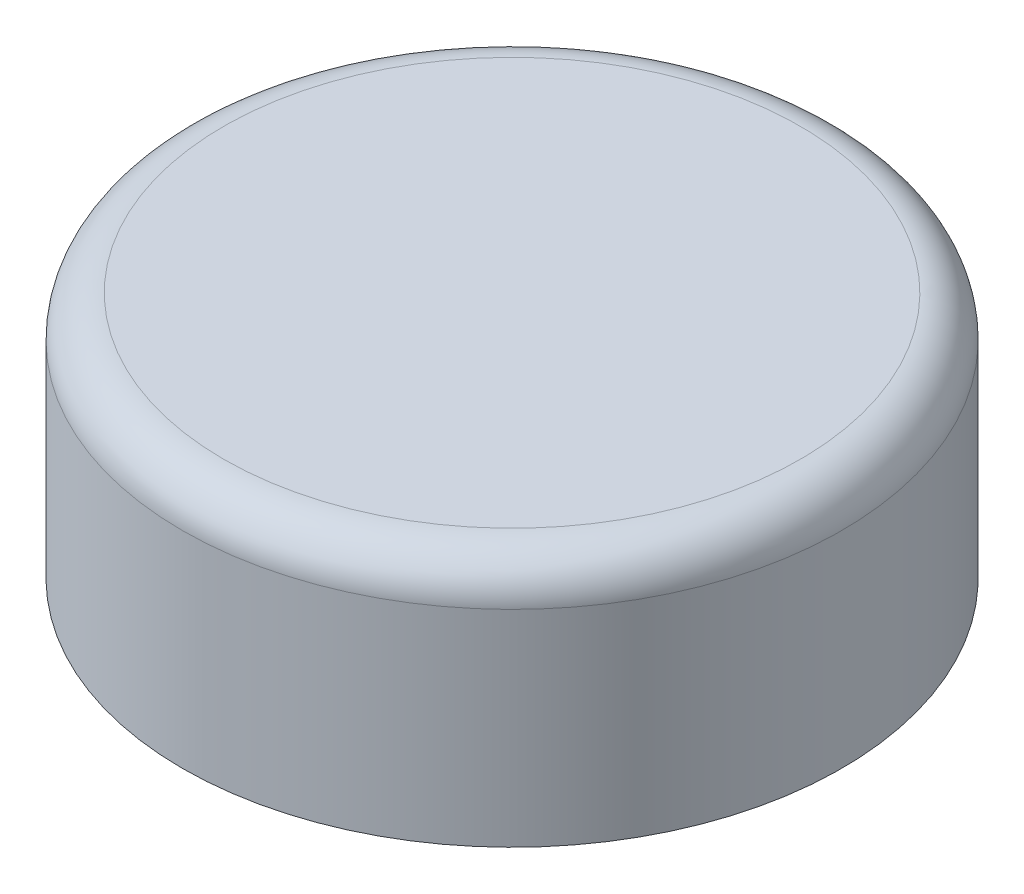
ISO-10303-21;
HEADER;
FILE_DESCRIPTION(('STEP AP214'),'2;1');
FILE_NAME('part.step','',(''),(''),'','','');
FILE_SCHEMA(('AUTOMOTIVE_DESIGN { 1 0 10303 214 1 1 1 1 }'));
ENDSEC;
DATA;
#1=APPLICATION_CONTEXT('core data for automotive mechanical design processes');
#2=APPLICATION_PROTOCOL_DEFINITION('international standard','automotive_design',2000,#1);
#3=PRODUCT_CONTEXT('',#1,'mechanical');
#4=PRODUCT('Part','Part','',(#3));
#5=PRODUCT_RELATED_PRODUCT_CATEGORY('part','',(#4));
#6=PRODUCT_DEFINITION_FORMATION('','',#4);
#7=PRODUCT_DEFINITION_CONTEXT('part definition',#1,'design');
#8=PRODUCT_DEFINITION('design','',#6,#7);
#9=PRODUCT_DEFINITION_SHAPE('','',#8);
#10=(LENGTH_UNIT() NAMED_UNIT(*) SI_UNIT(.MILLI.,.METRE.));
#11=(NAMED_UNIT(*) PLANE_ANGLE_UNIT() SI_UNIT($,.RADIAN.));
#12=(NAMED_UNIT(*) SI_UNIT($,.STERADIAN.) SOLID_ANGLE_UNIT());
#13=UNCERTAINTY_MEASURE_WITH_UNIT(LENGTH_MEASURE(1.E-05),#10,'distance_accuracy_value','');
#14=(GEOMETRIC_REPRESENTATION_CONTEXT(3) GLOBAL_UNCERTAINTY_ASSIGNED_CONTEXT((#13)) GLOBAL_UNIT_ASSIGNED_CONTEXT((#10,
#11,#12)) REPRESENTATION_CONTEXT('',''));
#15=CARTESIAN_POINT('',(0.,0.,0.));
#16=DIRECTION('',(0.,0.,1.));
#17=DIRECTION('',(1.,0.,0.));
#18=AXIS2_PLACEMENT_3D('',#15,#16,#17);
#19=CARTESIAN_POINT('',(0.,30.,0.));
#20=DIRECTION('',(0.,-1.,0.));
#21=DIRECTION('',(0.,0.,-1.));
#22=AXIS2_PLACEMENT_3D('',#19,#20,#21);
#23=CYLINDRICAL_SURFACE('',#22,40.);
#24=CARTESIAN_POINT('',(0.,25.,0.));
#25=DIRECTION('',(0.,1.,0.));
#26=DIRECTION('',(0.,0.,1.));
#27=AXIS2_PLACEMENT_3D('',#24,#25,#26);
#28=CIRCLE('',#27,40.);
#29=CARTESIAN_POINT('',(0.,25.,40.));
#30=VERTEX_POINT('',#29);
#31=EDGE_CURVE('E10',#30,#30,#28,.F.);
#32=ORIENTED_EDGE('',*,*,#31,.T.);
#33=EDGE_LOOP('',(#32));
#34=FACE_BOUND('',#33,.T.);
#35=CARTESIAN_POINT('',(0.,0.,0.));
#36=DIRECTION('',(0.,1.,0.));
#37=DIRECTION('',(0.,0.,1.));
#38=AXIS2_PLACEMENT_3D('',#35,#36,#37);
#39=CIRCLE('',#38,40.);
#40=CARTESIAN_POINT('',(0.,0.,40.));
#41=VERTEX_POINT('',#40);
#42=EDGE_CURVE('E42',#41,#41,#39,.T.);
#43=ORIENTED_EDGE('',*,*,#42,.T.);
#44=EDGE_LOOP('',(#43));
#45=FACE_BOUND('',#44,.T.);
#46=ADVANCED_FACE('F31',(#34,#45),#23,.T.);
#47=CARTESIAN_POINT('',(0.,30.,0.));
#48=DIRECTION('',(0.,1.,0.));
#49=DIRECTION('',(0.,0.,1.));
#50=AXIS2_PLACEMENT_3D('',#47,#48,#49);
#51=PLANE('',#50);
#52=CARTESIAN_POINT('',(0.,30.,0.));
#53=DIRECTION('',(0.,1.,0.));
#54=DIRECTION('',(0.,0.,1.));
#55=AXIS2_PLACEMENT_3D('',#52,#53,#54);
#56=CIRCLE('',#55,35.);
#57=CARTESIAN_POINT('',(0.,30.,35.));
#58=VERTEX_POINT('',#57);
#59=EDGE_CURVE('E38',#58,#58,#56,.T.);
#60=ORIENTED_EDGE('',*,*,#59,.T.);
#61=EDGE_LOOP('',(#60));
#62=FACE_BOUND('',#61,.T.);
#63=ADVANCED_FACE('F66',(#62),#51,.T.);
#64=CARTESIAN_POINT('',(0.,0.,0.));
#65=DIRECTION('',(0.,1.,0.));
#66=DIRECTION('',(0.,0.,1.));
#67=AXIS2_PLACEMENT_3D('',#64,#65,#66);
#68=PLANE('',#67);
#69=CARTESIAN_POINT('',(0.,0.,0.));
#70=DIRECTION('',(0.,-1.,0.));
#71=DIRECTION('',(0.,0.,-1.));
#72=AXIS2_PLACEMENT_3D('',#69,#70,#71);
#73=CIRCLE('',#72,36.);
#74=CARTESIAN_POINT('',(0.,0.,-36.));
#75=VERTEX_POINT('',#74);
#76=EDGE_CURVE('E49',#75,#75,#73,.T.);
#77=ORIENTED_EDGE('',*,*,#76,.F.);
#78=EDGE_LOOP('',(#77));
#79=FACE_BOUND('',#78,.T.);
#80=ORIENTED_EDGE('',*,*,#42,.F.);
#81=EDGE_LOOP('',(#80));
#82=FACE_BOUND('',#81,.T.);
#83=ADVANCED_FACE('F63',(#79,#82),#68,.F.);
#84=CARTESIAN_POINT('',(0.,25.,0.));
#85=DIRECTION('',(0.,1.,0.));
#86=DIRECTION('',(0.,0.,1.));
#87=AXIS2_PLACEMENT_3D('',#84,#85,#86);
#88=TOROIDAL_SURFACE('',#87,35.,5.);
#89=ORIENTED_EDGE('',*,*,#31,.F.);
#90=EDGE_LOOP('',(#89));
#91=FACE_BOUND('',#90,.T.);
#92=ORIENTED_EDGE('',*,*,#59,.F.);
#93=EDGE_LOOP('',(#92));
#94=FACE_BOUND('',#93,.T.);
#95=ADVANCED_FACE('F33',(#91,#94),#88,.T.);
#96=CARTESIAN_POINT('',(0.,25.,0.));
#97=DIRECTION('',(0.,-1.,0.));
#98=DIRECTION('',(0.,0.,-1.));
#99=AXIS2_PLACEMENT_3D('',#96,#97,#98);
#100=CYLINDRICAL_SURFACE('',#99,36.);
#101=CARTESIAN_POINT('',(0.,25.,0.));
#102=DIRECTION('',(0.,-1.,0.));
#103=DIRECTION('',(0.,0.,-1.));
#104=AXIS2_PLACEMENT_3D('',#101,#102,#103);
#105=CIRCLE('',#104,36.);
#106=CARTESIAN_POINT('',(0.,25.,-36.));
#107=VERTEX_POINT('',#106);
#108=EDGE_CURVE('E46',#107,#107,#105,.T.);
#109=ORIENTED_EDGE('',*,*,#108,.F.);
#110=EDGE_LOOP('',(#109));
#111=FACE_BOUND('',#110,.T.);
#112=ORIENTED_EDGE('',*,*,#76,.T.);
#113=EDGE_LOOP('',(#112));
#114=FACE_BOUND('',#113,.T.);
#115=ADVANCED_FACE('F57',(#111,#114),#100,.F.);
#116=CARTESIAN_POINT('',(0.,25.,0.));
#117=DIRECTION('',(0.,-1.,0.));
#118=DIRECTION('',(0.,0.,-1.));
#119=AXIS2_PLACEMENT_3D('',#116,#117,#118);
#120=PLANE('',#119);
#121=ORIENTED_EDGE('',*,*,#108,.T.);
#122=EDGE_LOOP('',(#121));
#123=FACE_BOUND('',#122,.T.);
#124=ADVANCED_FACE('F55',(#123),#120,.T.);
#125=CLOSED_SHELL('',(#46,#63,#83,#95,#115,#124));
#126=MANIFOLD_SOLID_BREP('B2',#125);
#127=ADVANCED_BREP_SHAPE_REPRESENTATION('',(#18,#126),#14);
#128=SHAPE_DEFINITION_REPRESENTATION(#9,#127);
ENDSEC;
END-ISO-10303-21;
